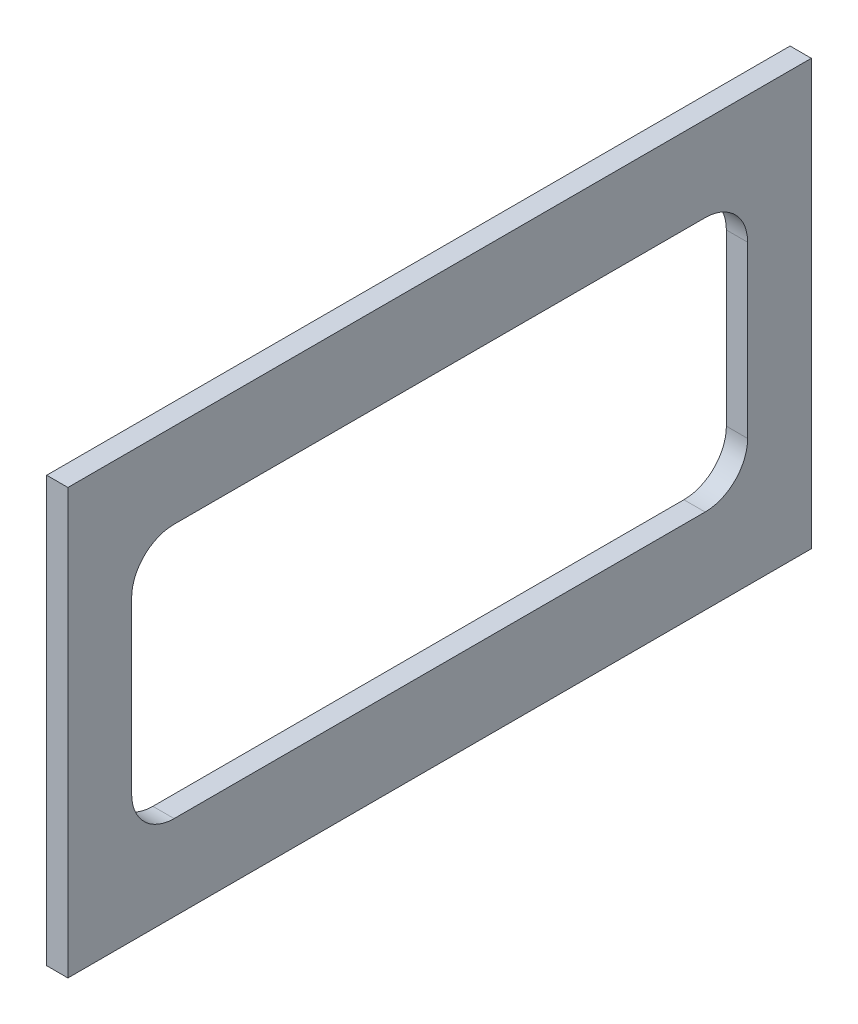
ISO-10303-21;
HEADER;
FILE_DESCRIPTION(('STEP AP214'),'2;1');
FILE_NAME('part.step','',(''),(''),'','','');
FILE_SCHEMA(('AUTOMOTIVE_DESIGN { 1 0 10303 214 1 1 1 1 }'));
ENDSEC;
DATA;
#1=APPLICATION_CONTEXT('core data for automotive mechanical design processes');
#2=APPLICATION_PROTOCOL_DEFINITION('international standard','automotive_design',2000,#1);
#3=PRODUCT_CONTEXT('',#1,'mechanical');
#4=PRODUCT('Part','Part','',(#3));
#5=PRODUCT_RELATED_PRODUCT_CATEGORY('part','',(#4));
#6=PRODUCT_DEFINITION_FORMATION('','',#4);
#7=PRODUCT_DEFINITION_CONTEXT('part definition',#1,'design');
#8=PRODUCT_DEFINITION('design','',#6,#7);
#9=PRODUCT_DEFINITION_SHAPE('','',#8);
#10=(LENGTH_UNIT() NAMED_UNIT(*) SI_UNIT(.MILLI.,.METRE.));
#11=(NAMED_UNIT(*) PLANE_ANGLE_UNIT() SI_UNIT($,.RADIAN.));
#12=(NAMED_UNIT(*) SI_UNIT($,.STERADIAN.) SOLID_ANGLE_UNIT());
#13=UNCERTAINTY_MEASURE_WITH_UNIT(LENGTH_MEASURE(1.E-05),#10,'distance_accuracy_value','');
#14=(GEOMETRIC_REPRESENTATION_CONTEXT(3) GLOBAL_UNCERTAINTY_ASSIGNED_CONTEXT((#13)) GLOBAL_UNIT_ASSIGNED_CONTEXT((#10,
#11,#12)) REPRESENTATION_CONTEXT('',''));
#15=CARTESIAN_POINT('',(0.,0.,0.));
#16=DIRECTION('',(0.,0.,1.));
#17=DIRECTION('',(1.,0.,0.));
#18=AXIS2_PLACEMENT_3D('',#15,#16,#17);
#19=CARTESIAN_POINT('',(3.175,0.,0.));
#20=DIRECTION('',(-1.,0.,0.));
#21=DIRECTION('',(0.,0.,1.));
#22=AXIS2_PLACEMENT_3D('',#19,#20,#21);
#23=PLANE('',#22);
#24=DIRECTION('',(0.,1.,0.));
#25=VECTOR('',#24,1.);
#26=CARTESIAN_POINT('',(3.175,-31.75,-55.5625));
#27=LINE('',#26,#25);
#28=CARTESIAN_POINT('',(3.175,-31.75,-55.5625));
#29=VERTEX_POINT('',#28);
#30=CARTESIAN_POINT('',(3.175,31.75,-55.5625));
#31=VERTEX_POINT('',#30);
#32=EDGE_CURVE('E218',#29,#31,#27,.T.);
#33=ORIENTED_EDGE('',*,*,#32,.T.);
#34=DIRECTION('',(0.,0.,1.));
#35=VECTOR('',#34,1.);
#36=CARTESIAN_POINT('',(3.175,31.75,55.5625));
#37=LINE('',#36,#35);
#38=CARTESIAN_POINT('',(3.175,31.75,55.5625));
#39=VERTEX_POINT('',#38);
#40=EDGE_CURVE('E222',#31,#39,#37,.T.);
#41=ORIENTED_EDGE('',*,*,#40,.T.);
#42=DIRECTION('',(0.,-1.,0.));
#43=VECTOR('',#42,1.);
#44=CARTESIAN_POINT('',(3.175,-31.75,55.5625));
#45=LINE('',#44,#43);
#46=CARTESIAN_POINT('',(3.175,-31.75,55.5625));
#47=VERTEX_POINT('',#46);
#48=EDGE_CURVE('E226',#39,#47,#45,.T.);
#49=ORIENTED_EDGE('',*,*,#48,.T.);
#50=DIRECTION('',(0.,0.,-1.));
#51=VECTOR('',#50,1.);
#52=CARTESIAN_POINT('',(3.175,-31.75,55.5625));
#53=LINE('',#52,#51);
#54=EDGE_CURVE('E229',#47,#29,#53,.T.);
#55=ORIENTED_EDGE('',*,*,#54,.T.);
#56=EDGE_LOOP('',(#33,#41,#49,#55));
#57=FACE_BOUND('',#56,.T.);
#58=CARTESIAN_POINT('',(3.175,-12.7,39.6875));
#59=DIRECTION('',(1.,0.,0.));
#60=DIRECTION('',(0.,0.,1.));
#61=AXIS2_PLACEMENT_3D('',#58,#59,#60);
#62=CIRCLE('',#61,6.35);
#63=CARTESIAN_POINT('',(3.175,-12.6999999999999,46.0375));
#64=VERTEX_POINT('',#63);
#65=CARTESIAN_POINT('',(3.175,-19.05,39.6875));
#66=VERTEX_POINT('',#65);
#67=EDGE_CURVE('E129',#64,#66,#62,.T.);
#68=ORIENTED_EDGE('',*,*,#67,.F.);
#69=DIRECTION('',(0.,-1.,0.));
#70=VECTOR('',#69,1.);
#71=CARTESIAN_POINT('',(3.175,-12.6999999999999,46.0375));
#72=LINE('',#71,#70);
#73=CARTESIAN_POINT('',(3.175,12.7,46.0375));
#74=VERTEX_POINT('',#73);
#75=EDGE_CURVE('E170',#74,#64,#72,.T.);
#76=ORIENTED_EDGE('',*,*,#75,.F.);
#77=CARTESIAN_POINT('',(3.175,12.7,39.6875));
#78=DIRECTION('',(1.,0.,0.));
#79=DIRECTION('',(0.,0.,1.));
#80=AXIS2_PLACEMENT_3D('',#77,#78,#79);
#81=CIRCLE('',#80,6.35);
#82=CARTESIAN_POINT('',(3.175,19.05,39.6875));
#83=VERTEX_POINT('',#82);
#84=EDGE_CURVE('E167',#83,#74,#81,.T.);
#85=ORIENTED_EDGE('',*,*,#84,.F.);
#86=DIRECTION('',(0.,0.,1.));
#87=VECTOR('',#86,1.);
#88=CARTESIAN_POINT('',(3.175,19.05,39.6875));
#89=LINE('',#88,#87);
#90=CARTESIAN_POINT('',(3.175,19.05,-39.6874999999999));
#91=VERTEX_POINT('',#90);
#92=EDGE_CURVE('E164',#91,#83,#89,.T.);
#93=ORIENTED_EDGE('',*,*,#92,.F.);
#94=CARTESIAN_POINT('',(3.175,12.7,-39.6875));
#95=DIRECTION('',(1.,0.,0.));
#96=DIRECTION('',(0.,0.,1.));
#97=AXIS2_PLACEMENT_3D('',#94,#95,#96);
#98=CIRCLE('',#97,6.35);
#99=CARTESIAN_POINT('',(3.175,12.7,-46.0375));
#100=VERTEX_POINT('',#99);
#101=EDGE_CURVE('E161',#100,#91,#98,.T.);
#102=ORIENTED_EDGE('',*,*,#101,.F.);
#103=DIRECTION('',(0.,1.,0.));
#104=VECTOR('',#103,1.);
#105=CARTESIAN_POINT('',(3.175,-12.6999999999999,-46.0375));
#106=LINE('',#105,#104);
#107=CARTESIAN_POINT('',(3.175,-12.7,-46.0375));
#108=VERTEX_POINT('',#107);
#109=EDGE_CURVE('E156',#108,#100,#106,.T.);
#110=ORIENTED_EDGE('',*,*,#109,.F.);
#111=CARTESIAN_POINT('',(3.175,-12.7,-39.6875));
#112=DIRECTION('',(1.,0.,0.));
#113=DIRECTION('',(0.,0.,-1.));
#114=AXIS2_PLACEMENT_3D('',#111,#112,#113);
#115=CIRCLE('',#114,6.35);
#116=CARTESIAN_POINT('',(3.175,-19.05,-39.6874999999999));
#117=VERTEX_POINT('',#116);
#118=EDGE_CURVE('E152',#117,#108,#115,.T.);
#119=ORIENTED_EDGE('',*,*,#118,.F.);
#120=DIRECTION('',(0.,0.,-1.));
#121=VECTOR('',#120,1.);
#122=CARTESIAN_POINT('',(3.175,-19.05,39.6875));
#123=LINE('',#122,#121);
#124=EDGE_CURVE('E138',#66,#117,#123,.T.);
#125=ORIENTED_EDGE('',*,*,#124,.F.);
#126=EDGE_LOOP('',(#68,#76,#85,#93,#102,#110,#119,#125));
#127=FACE_BOUND('',#126,.T.);
#128=ADVANCED_FACE('F39',(#57,#127),#23,.F.);
#129=CARTESIAN_POINT('',(0.,0.,0.));
#130=DIRECTION('',(-1.,0.,0.));
#131=DIRECTION('',(0.,0.,1.));
#132=AXIS2_PLACEMENT_3D('',#129,#130,#131);
#133=PLANE('',#132);
#134=DIRECTION('',(0.,1.,0.));
#135=VECTOR('',#134,1.);
#136=CARTESIAN_POINT('',(0.,-31.75,-55.5625));
#137=LINE('',#136,#135);
#138=CARTESIAN_POINT('',(0.,-31.75,-55.5625));
#139=VERTEX_POINT('',#138);
#140=CARTESIAN_POINT('',(0.,31.75,-55.5625));
#141=VERTEX_POINT('',#140);
#142=EDGE_CURVE('E147',#139,#141,#137,.T.);
#143=ORIENTED_EDGE('',*,*,#142,.F.);
#144=DIRECTION('',(0.,0.,-1.));
#145=VECTOR('',#144,1.);
#146=CARTESIAN_POINT('',(0.,-31.75,55.5625));
#147=LINE('',#146,#145);
#148=CARTESIAN_POINT('',(0.,-31.75,55.5625));
#149=VERTEX_POINT('',#148);
#150=EDGE_CURVE('E223',#149,#139,#147,.T.);
#151=ORIENTED_EDGE('',*,*,#150,.F.);
#152=DIRECTION('',(0.,-1.,0.));
#153=VECTOR('',#152,1.);
#154=CARTESIAN_POINT('',(0.,-31.75,55.5625));
#155=LINE('',#154,#153);
#156=CARTESIAN_POINT('',(0.,31.75,55.5625));
#157=VERTEX_POINT('',#156);
#158=EDGE_CURVE('E239',#157,#149,#155,.T.);
#159=ORIENTED_EDGE('',*,*,#158,.F.);
#160=DIRECTION('',(0.,0.,1.));
#161=VECTOR('',#160,1.);
#162=CARTESIAN_POINT('',(0.,31.75,55.5625));
#163=LINE('',#162,#161);
#164=EDGE_CURVE('E236',#141,#157,#163,.T.);
#165=ORIENTED_EDGE('',*,*,#164,.F.);
#166=EDGE_LOOP('',(#143,#151,#159,#165));
#167=FACE_BOUND('',#166,.T.);
#168=DIRECTION('',(0.,-1.,0.));
#169=VECTOR('',#168,1.);
#170=CARTESIAN_POINT('',(0.,-12.6999999999999,46.0375));
#171=LINE('',#170,#169);
#172=CARTESIAN_POINT('',(0.,12.7,46.0375));
#173=VERTEX_POINT('',#172);
#174=CARTESIAN_POINT('',(0.,-12.6999999999999,46.0375));
#175=VERTEX_POINT('',#174);
#176=EDGE_CURVE('E139',#173,#175,#171,.T.);
#177=ORIENTED_EDGE('',*,*,#176,.T.);
#178=CARTESIAN_POINT('',(0.,-12.7,39.6875));
#179=DIRECTION('',(1.,0.,0.));
#180=DIRECTION('',(0.,0.,1.));
#181=AXIS2_PLACEMENT_3D('',#178,#179,#180);
#182=CIRCLE('',#181,6.35);
#183=CARTESIAN_POINT('',(0.,-19.05,39.6875));
#184=VERTEX_POINT('',#183);
#185=EDGE_CURVE('E63',#175,#184,#182,.T.);
#186=ORIENTED_EDGE('',*,*,#185,.T.);
#187=DIRECTION('',(0.,0.,-1.));
#188=VECTOR('',#187,1.);
#189=CARTESIAN_POINT('',(0.,-19.05,39.6875));
#190=LINE('',#189,#188);
#191=CARTESIAN_POINT('',(0.,-19.05,-39.6874999999999));
#192=VERTEX_POINT('',#191);
#193=EDGE_CURVE('E145',#184,#192,#190,.T.);
#194=ORIENTED_EDGE('',*,*,#193,.T.);
#195=CARTESIAN_POINT('',(0.,-12.7,-39.6875));
#196=DIRECTION('',(1.,0.,0.));
#197=DIRECTION('',(0.,0.,-1.));
#198=AXIS2_PLACEMENT_3D('',#195,#196,#197);
#199=CIRCLE('',#198,6.35);
#200=CARTESIAN_POINT('',(0.,-12.7,-46.0375));
#201=VERTEX_POINT('',#200);
#202=EDGE_CURVE('E177',#192,#201,#199,.T.);
#203=ORIENTED_EDGE('',*,*,#202,.T.);
#204=DIRECTION('',(0.,1.,0.));
#205=VECTOR('',#204,1.);
#206=CARTESIAN_POINT('',(0.,-12.6999999999999,-46.0375));
#207=LINE('',#206,#205);
#208=CARTESIAN_POINT('',(0.,12.7,-46.0375));
#209=VERTEX_POINT('',#208);
#210=EDGE_CURVE('E181',#201,#209,#207,.T.);
#211=ORIENTED_EDGE('',*,*,#210,.T.);
#212=CARTESIAN_POINT('',(0.,12.7,-39.6875));
#213=DIRECTION('',(1.,0.,0.));
#214=DIRECTION('',(0.,0.,1.));
#215=AXIS2_PLACEMENT_3D('',#212,#213,#214);
#216=CIRCLE('',#215,6.35);
#217=CARTESIAN_POINT('',(0.,19.05,-39.6874999999999));
#218=VERTEX_POINT('',#217);
#219=EDGE_CURVE('E185',#209,#218,#216,.T.);
#220=ORIENTED_EDGE('',*,*,#219,.T.);
#221=DIRECTION('',(0.,0.,1.));
#222=VECTOR('',#221,1.);
#223=CARTESIAN_POINT('',(0.,19.05,39.6875));
#224=LINE('',#223,#222);
#225=CARTESIAN_POINT('',(0.,19.05,39.6875));
#226=VERTEX_POINT('',#225);
#227=EDGE_CURVE('E189',#218,#226,#224,.T.);
#228=ORIENTED_EDGE('',*,*,#227,.T.);
#229=CARTESIAN_POINT('',(0.,12.7,39.6875));
#230=DIRECTION('',(1.,0.,0.));
#231=DIRECTION('',(0.,0.,1.));
#232=AXIS2_PLACEMENT_3D('',#229,#230,#231);
#233=CIRCLE('',#232,6.35);
#234=EDGE_CURVE('E193',#226,#173,#233,.T.);
#235=ORIENTED_EDGE('',*,*,#234,.T.);
#236=EDGE_LOOP('',(#177,#186,#194,#203,#211,#220,#228,#235));
#237=FACE_BOUND('',#236,.T.);
#238=ADVANCED_FACE('F262',(#167,#237),#133,.T.);
#239=CARTESIAN_POINT('',(3.175,-31.75,-55.5625));
#240=DIRECTION('',(0.,0.,1.));
#241=DIRECTION('',(1.,0.,0.));
#242=AXIS2_PLACEMENT_3D('',#239,#240,#241);
#243=PLANE('',#242);
#244=ORIENTED_EDGE('',*,*,#142,.T.);
#245=DIRECTION('',(-1.,0.,0.));
#246=VECTOR('',#245,1.);
#247=CARTESIAN_POINT('',(3.175,31.75,-55.5625));
#248=LINE('',#247,#246);
#249=EDGE_CURVE('E11',#31,#141,#248,.T.);
#250=ORIENTED_EDGE('',*,*,#249,.F.);
#251=ORIENTED_EDGE('',*,*,#32,.F.);
#252=DIRECTION('',(-1.,0.,0.));
#253=VECTOR('',#252,1.);
#254=CARTESIAN_POINT('',(3.175,-31.75,-55.5625));
#255=LINE('',#254,#253);
#256=EDGE_CURVE('E232',#29,#139,#255,.T.);
#257=ORIENTED_EDGE('',*,*,#256,.T.);
#258=EDGE_LOOP('',(#244,#250,#251,#257));
#259=FACE_BOUND('',#258,.T.);
#260=ADVANCED_FACE('F41',(#259),#243,.F.);
#261=CARTESIAN_POINT('',(3.175,31.75,55.5625));
#262=DIRECTION('',(0.,-1.,0.));
#263=DIRECTION('',(0.,0.,-1.));
#264=AXIS2_PLACEMENT_3D('',#261,#262,#263);
#265=PLANE('',#264);
#266=ORIENTED_EDGE('',*,*,#164,.T.);
#267=DIRECTION('',(-1.,0.,0.));
#268=VECTOR('',#267,1.);
#269=CARTESIAN_POINT('',(3.175,31.75,55.5625));
#270=LINE('',#269,#268);
#271=EDGE_CURVE('E48',#39,#157,#270,.T.);
#272=ORIENTED_EDGE('',*,*,#271,.F.);
#273=ORIENTED_EDGE('',*,*,#40,.F.);
#274=ORIENTED_EDGE('',*,*,#249,.T.);
#275=EDGE_LOOP('',(#266,#272,#273,#274));
#276=FACE_BOUND('',#275,.T.);
#277=ADVANCED_FACE('F272',(#276),#265,.F.);
#278=CARTESIAN_POINT('',(3.175,-31.75,55.5625));
#279=DIRECTION('',(0.,0.,-1.));
#280=DIRECTION('',(-1.,0.,0.));
#281=AXIS2_PLACEMENT_3D('',#278,#279,#280);
#282=PLANE('',#281);
#283=ORIENTED_EDGE('',*,*,#158,.T.);
#284=DIRECTION('',(-1.,0.,0.));
#285=VECTOR('',#284,1.);
#286=CARTESIAN_POINT('',(3.175,-31.75,55.5625));
#287=LINE('',#286,#285);
#288=EDGE_CURVE('E247',#47,#149,#287,.T.);
#289=ORIENTED_EDGE('',*,*,#288,.F.);
#290=ORIENTED_EDGE('',*,*,#48,.F.);
#291=ORIENTED_EDGE('',*,*,#271,.T.);
#292=EDGE_LOOP('',(#283,#289,#290,#291));
#293=FACE_BOUND('',#292,.T.);
#294=ADVANCED_FACE('F256',(#293),#282,.F.);
#295=CARTESIAN_POINT('',(3.175,-31.75,55.5625));
#296=DIRECTION('',(0.,1.,0.));
#297=DIRECTION('',(0.,0.,1.));
#298=AXIS2_PLACEMENT_3D('',#295,#296,#297);
#299=PLANE('',#298);
#300=ORIENTED_EDGE('',*,*,#150,.T.);
#301=ORIENTED_EDGE('',*,*,#256,.F.);
#302=ORIENTED_EDGE('',*,*,#54,.F.);
#303=ORIENTED_EDGE('',*,*,#288,.T.);
#304=EDGE_LOOP('',(#300,#301,#302,#303));
#305=FACE_BOUND('',#304,.T.);
#306=ADVANCED_FACE('F266',(#305),#299,.F.);
#307=CARTESIAN_POINT('',(3.175,-12.7,39.6875));
#308=DIRECTION('',(-1.,0.,0.));
#309=DIRECTION('',(0.,0.,1.));
#310=AXIS2_PLACEMENT_3D('',#307,#308,#309);
#311=CYLINDRICAL_SURFACE('',#310,6.35);
#312=ORIENTED_EDGE('',*,*,#185,.F.);
#313=DIRECTION('',(-1.,0.,0.));
#314=VECTOR('',#313,1.);
#315=CARTESIAN_POINT('',(3.175,-12.6999999999999,46.0375));
#316=LINE('',#315,#314);
#317=EDGE_CURVE('E133',#64,#175,#316,.T.);
#318=ORIENTED_EDGE('',*,*,#317,.F.);
#319=ORIENTED_EDGE('',*,*,#67,.T.);
#320=DIRECTION('',(-1.,0.,0.));
#321=VECTOR('',#320,1.);
#322=CARTESIAN_POINT('',(3.175,-19.05,39.6875));
#323=LINE('',#322,#321);
#324=EDGE_CURVE('E132',#66,#184,#323,.T.);
#325=ORIENTED_EDGE('',*,*,#324,.T.);
#326=EDGE_LOOP('',(#312,#318,#319,#325));
#327=FACE_BOUND('',#326,.T.);
#328=ADVANCED_FACE('F131',(#327),#311,.F.);
#329=CARTESIAN_POINT('',(3.175,-19.05,39.6875));
#330=DIRECTION('',(0.,1.,0.));
#331=DIRECTION('',(0.,0.,1.));
#332=AXIS2_PLACEMENT_3D('',#329,#330,#331);
#333=PLANE('',#332);
#334=ORIENTED_EDGE('',*,*,#193,.F.);
#335=ORIENTED_EDGE('',*,*,#324,.F.);
#336=ORIENTED_EDGE('',*,*,#124,.T.);
#337=DIRECTION('',(-1.,0.,0.));
#338=VECTOR('',#337,1.);
#339=CARTESIAN_POINT('',(3.175,-19.05,-39.6874999999999));
#340=LINE('',#339,#338);
#341=EDGE_CURVE('E148',#117,#192,#340,.T.);
#342=ORIENTED_EDGE('',*,*,#341,.T.);
#343=EDGE_LOOP('',(#334,#335,#336,#342));
#344=FACE_BOUND('',#343,.T.);
#345=ADVANCED_FACE('F142',(#344),#333,.T.);
#346=CARTESIAN_POINT('',(3.175,-12.7,-39.6875));
#347=DIRECTION('',(-1.,0.,0.));
#348=DIRECTION('',(0.,0.,1.));
#349=AXIS2_PLACEMENT_3D('',#346,#347,#348);
#350=CYLINDRICAL_SURFACE('',#349,6.35);
#351=ORIENTED_EDGE('',*,*,#202,.F.);
#352=ORIENTED_EDGE('',*,*,#341,.F.);
#353=ORIENTED_EDGE('',*,*,#118,.T.);
#354=DIRECTION('',(-1.,0.,0.));
#355=VECTOR('',#354,1.);
#356=CARTESIAN_POINT('',(3.175,-12.7,-46.0375));
#357=LINE('',#356,#355);
#358=EDGE_CURVE('E213',#108,#201,#357,.T.);
#359=ORIENTED_EDGE('',*,*,#358,.T.);
#360=EDGE_LOOP('',(#351,#352,#353,#359));
#361=FACE_BOUND('',#360,.T.);
#362=ADVANCED_FACE('F295',(#361),#350,.F.);
#363=CARTESIAN_POINT('',(3.175,-12.6999999999999,-46.0375));
#364=DIRECTION('',(0.,0.,1.));
#365=DIRECTION('',(1.,0.,0.));
#366=AXIS2_PLACEMENT_3D('',#363,#364,#365);
#367=PLANE('',#366);
#368=ORIENTED_EDGE('',*,*,#210,.F.);
#369=ORIENTED_EDGE('',*,*,#358,.F.);
#370=ORIENTED_EDGE('',*,*,#109,.T.);
#371=DIRECTION('',(-1.,0.,0.));
#372=VECTOR('',#371,1.);
#373=CARTESIAN_POINT('',(3.175,12.7,-46.0375));
#374=LINE('',#373,#372);
#375=EDGE_CURVE('E210',#100,#209,#374,.T.);
#376=ORIENTED_EDGE('',*,*,#375,.T.);
#377=EDGE_LOOP('',(#368,#369,#370,#376));
#378=FACE_BOUND('',#377,.T.);
#379=ADVANCED_FACE('F299',(#378),#367,.T.);
#380=CARTESIAN_POINT('',(3.175,12.7,-39.6875));
#381=DIRECTION('',(-1.,0.,0.));
#382=DIRECTION('',(0.,0.,1.));
#383=AXIS2_PLACEMENT_3D('',#380,#381,#382);
#384=CYLINDRICAL_SURFACE('',#383,6.35);
#385=ORIENTED_EDGE('',*,*,#219,.F.);
#386=ORIENTED_EDGE('',*,*,#375,.F.);
#387=ORIENTED_EDGE('',*,*,#101,.T.);
#388=DIRECTION('',(-1.,0.,0.));
#389=VECTOR('',#388,1.);
#390=CARTESIAN_POINT('',(3.175,19.05,-39.6874999999999));
#391=LINE('',#390,#389);
#392=EDGE_CURVE('E207',#91,#218,#391,.T.);
#393=ORIENTED_EDGE('',*,*,#392,.T.);
#394=EDGE_LOOP('',(#385,#386,#387,#393));
#395=FACE_BOUND('',#394,.T.);
#396=ADVANCED_FACE('F305',(#395),#384,.F.);
#397=CARTESIAN_POINT('',(3.175,19.05,39.6875));
#398=DIRECTION('',(0.,-1.,0.));
#399=DIRECTION('',(0.,0.,-1.));
#400=AXIS2_PLACEMENT_3D('',#397,#398,#399);
#401=PLANE('',#400);
#402=ORIENTED_EDGE('',*,*,#227,.F.);
#403=ORIENTED_EDGE('',*,*,#392,.F.);
#404=ORIENTED_EDGE('',*,*,#92,.T.);
#405=DIRECTION('',(-1.,0.,0.));
#406=VECTOR('',#405,1.);
#407=CARTESIAN_POINT('',(3.175,19.05,39.6875));
#408=LINE('',#407,#406);
#409=EDGE_CURVE('E204',#83,#226,#408,.T.);
#410=ORIENTED_EDGE('',*,*,#409,.T.);
#411=EDGE_LOOP('',(#402,#403,#404,#410));
#412=FACE_BOUND('',#411,.T.);
#413=ADVANCED_FACE('F309',(#412),#401,.T.);
#414=CARTESIAN_POINT('',(3.175,12.7,39.6875));
#415=DIRECTION('',(-1.,0.,0.));
#416=DIRECTION('',(0.,0.,1.));
#417=AXIS2_PLACEMENT_3D('',#414,#415,#416);
#418=CYLINDRICAL_SURFACE('',#417,6.35);
#419=ORIENTED_EDGE('',*,*,#234,.F.);
#420=ORIENTED_EDGE('',*,*,#409,.F.);
#421=ORIENTED_EDGE('',*,*,#84,.T.);
#422=DIRECTION('',(-1.,0.,0.));
#423=VECTOR('',#422,1.);
#424=CARTESIAN_POINT('',(3.175,12.7,46.0375));
#425=LINE('',#424,#423);
#426=EDGE_CURVE('E55',#74,#173,#425,.T.);
#427=ORIENTED_EDGE('',*,*,#426,.T.);
#428=EDGE_LOOP('',(#419,#420,#421,#427));
#429=FACE_BOUND('',#428,.T.);
#430=ADVANCED_FACE('F313',(#429),#418,.F.);
#431=CARTESIAN_POINT('',(3.175,-12.6999999999999,46.0375));
#432=DIRECTION('',(0.,0.,-1.));
#433=DIRECTION('',(-1.,0.,0.));
#434=AXIS2_PLACEMENT_3D('',#431,#432,#433);
#435=PLANE('',#434);
#436=ORIENTED_EDGE('',*,*,#176,.F.);
#437=ORIENTED_EDGE('',*,*,#426,.F.);
#438=ORIENTED_EDGE('',*,*,#75,.T.);
#439=ORIENTED_EDGE('',*,*,#317,.T.);
#440=EDGE_LOOP('',(#436,#437,#438,#439));
#441=FACE_BOUND('',#440,.T.);
#442=ADVANCED_FACE('F317',(#441),#435,.T.);
#443=CLOSED_SHELL('',(#128,#238,#260,#277,#294,#306,#328,#345,#362,#379,#396,#413,#430,#442));
#444=MANIFOLD_SOLID_BREP('B2',#443);
#445=ADVANCED_BREP_SHAPE_REPRESENTATION('',(#18,#444),#14);
#446=SHAPE_DEFINITION_REPRESENTATION(#9,#445);
ENDSEC;
END-ISO-10303-21;
